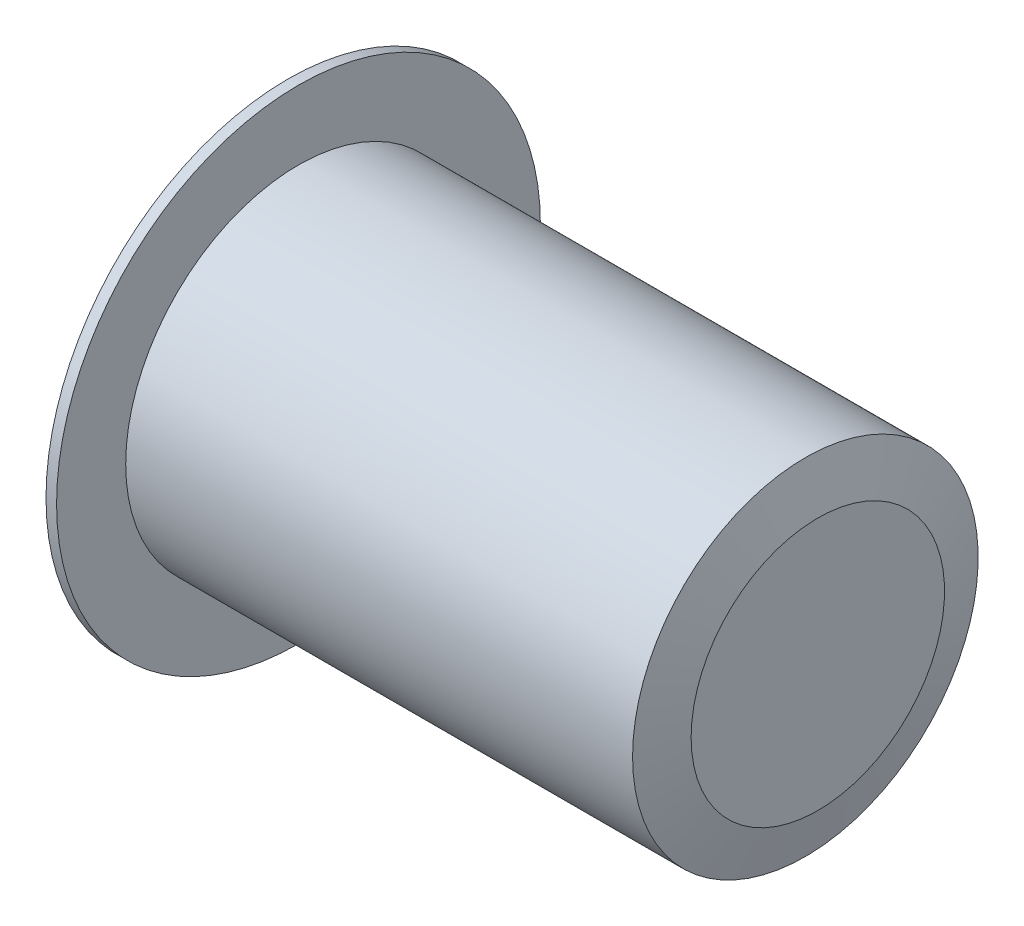
ISO-10303-21;
HEADER;
FILE_DESCRIPTION(('STEP AP214'),'2;1');
FILE_NAME('part.step','',(''),(''),'','','');
FILE_SCHEMA(('AUTOMOTIVE_DESIGN { 1 0 10303 214 1 1 1 1 }'));
ENDSEC;
DATA;
#1=APPLICATION_CONTEXT('core data for automotive mechanical design processes');
#2=APPLICATION_PROTOCOL_DEFINITION('international standard','automotive_design',2000,#1);
#3=PRODUCT_CONTEXT('',#1,'mechanical');
#4=PRODUCT('Part','Part','',(#3));
#5=PRODUCT_RELATED_PRODUCT_CATEGORY('part','',(#4));
#6=PRODUCT_DEFINITION_FORMATION('','',#4);
#7=PRODUCT_DEFINITION_CONTEXT('part definition',#1,'design');
#8=PRODUCT_DEFINITION('design','',#6,#7);
#9=PRODUCT_DEFINITION_SHAPE('','',#8);
#10=(LENGTH_UNIT() NAMED_UNIT(*) SI_UNIT(.MILLI.,.METRE.));
#11=(NAMED_UNIT(*) PLANE_ANGLE_UNIT() SI_UNIT($,.RADIAN.));
#12=(NAMED_UNIT(*) SI_UNIT($,.STERADIAN.) SOLID_ANGLE_UNIT());
#13=UNCERTAINTY_MEASURE_WITH_UNIT(LENGTH_MEASURE(1.E-05),#10,'distance_accuracy_value','');
#14=(GEOMETRIC_REPRESENTATION_CONTEXT(3) GLOBAL_UNCERTAINTY_ASSIGNED_CONTEXT((#13)) GLOBAL_UNIT_ASSIGNED_CONTEXT((#10,
#11,#12)) REPRESENTATION_CONTEXT('',''));
#15=CARTESIAN_POINT('',(0.,0.,0.));
#16=DIRECTION('',(0.,0.,1.));
#17=DIRECTION('',(1.,0.,0.));
#18=AXIS2_PLACEMENT_3D('',#15,#16,#17);
#19=CARTESIAN_POINT('',(230.,0.,0.));
#20=DIRECTION('',(1.,0.,0.));
#21=DIRECTION('',(0.,0.,-1.));
#22=AXIS2_PLACEMENT_3D('',#19,#20,#21);
#23=PLANE('',#22);
#24=CARTESIAN_POINT('',(230.,0.,0.));
#25=DIRECTION('',(-1.,0.,0.));
#26=DIRECTION('',(0.,0.,1.));
#27=AXIS2_PLACEMENT_3D('',#24,#25,#26);
#28=CIRCLE('',#27,55.);
#29=CARTESIAN_POINT('',(230.,0.,55.));
#30=VERTEX_POINT('',#29);
#31=EDGE_CURVE('E10',#30,#30,#28,.T.);
#32=ORIENTED_EDGE('',*,*,#31,.F.);
#33=EDGE_LOOP('',(#32));
#34=FACE_BOUND('',#33,.T.);
#35=ADVANCED_FACE('F37',(#34),#23,.T.);
#36=CARTESIAN_POINT('',(224.590509296755,0.,0.));
#37=DIRECTION('',(-1.,0.,0.));
#38=DIRECTION('',(0.,0.,1.));
#39=AXIS2_PLACEMENT_3D('',#36,#37,#38);
#40=CONICAL_SURFACE('',#39,75.,1.30664225310287);
#41=ORIENTED_EDGE('',*,*,#31,.T.);
#42=EDGE_LOOP('',(#41));
#43=FACE_BOUND('',#42,.T.);
#44=CARTESIAN_POINT('',(224.590509296755,0.,0.));
#45=DIRECTION('',(-1.,0.,0.));
#46=DIRECTION('',(0.,0.,1.));
#47=AXIS2_PLACEMENT_3D('',#44,#45,#46);
#48=CIRCLE('',#47,75.);
#49=CARTESIAN_POINT('',(224.590509296755,0.,75.));
#50=VERTEX_POINT('',#49);
#51=EDGE_CURVE('E43',#50,#50,#48,.T.);
#52=ORIENTED_EDGE('',*,*,#51,.F.);
#53=EDGE_LOOP('',(#52));
#54=FACE_BOUND('',#53,.T.);
#55=ADVANCED_FACE('F92',(#43,#54),#40,.T.);
#56=CARTESIAN_POINT('',(0.,0.,0.));
#57=DIRECTION('',(-1.,0.,0.));
#58=DIRECTION('',(0.,0.,1.));
#59=AXIS2_PLACEMENT_3D('',#56,#57,#58);
#60=CYLINDRICAL_SURFACE('',#59,75.);
#61=ORIENTED_EDGE('',*,*,#51,.T.);
#62=EDGE_LOOP('',(#61));
#63=FACE_BOUND('',#62,.T.);
#64=CARTESIAN_POINT('',(4.59050929675552,0.,0.));
#65=DIRECTION('',(-1.,0.,0.));
#66=DIRECTION('',(0.,0.,1.));
#67=AXIS2_PLACEMENT_3D('',#64,#65,#66);
#68=CIRCLE('',#67,75.);
#69=CARTESIAN_POINT('',(4.59050929675552,0.,75.));
#70=VERTEX_POINT('',#69);
#71=EDGE_CURVE('E47',#70,#70,#68,.T.);
#72=ORIENTED_EDGE('',*,*,#71,.F.);
#73=EDGE_LOOP('',(#72));
#74=FACE_BOUND('',#73,.T.);
#75=ADVANCED_FACE('F88',(#63,#74),#60,.T.);
#76=CARTESIAN_POINT('',(4.59050929675551,0.,0.));
#77=DIRECTION('',(1.,0.,0.));
#78=DIRECTION('',(0.,0.,-1.));
#79=AXIS2_PLACEMENT_3D('',#76,#77,#78);
#80=PLANE('',#79);
#81=ORIENTED_EDGE('',*,*,#71,.T.);
#82=EDGE_LOOP('',(#81));
#83=FACE_BOUND('',#82,.T.);
#84=CARTESIAN_POINT('',(4.5905092967555,0.,0.));
#85=DIRECTION('',(-1.,0.,0.));
#86=DIRECTION('',(0.,0.,1.));
#87=AXIS2_PLACEMENT_3D('',#84,#85,#86);
#88=CIRCLE('',#87,105.);
#89=CARTESIAN_POINT('',(4.5905092967555,0.,105.));
#90=VERTEX_POINT('',#89);
#91=EDGE_CURVE('E51',#90,#90,#88,.T.);
#92=ORIENTED_EDGE('',*,*,#91,.F.);
#93=EDGE_LOOP('',(#92));
#94=FACE_BOUND('',#93,.T.);
#95=ADVANCED_FACE('F82',(#83,#94),#80,.T.);
#96=CARTESIAN_POINT('',(0.,0.,0.));
#97=DIRECTION('',(-1.,0.,0.));
#98=DIRECTION('',(0.,0.,1.));
#99=AXIS2_PLACEMENT_3D('',#96,#97,#98);
#100=CYLINDRICAL_SURFACE('',#99,105.);
#101=ORIENTED_EDGE('',*,*,#91,.T.);
#102=EDGE_LOOP('',(#101));
#103=FACE_BOUND('',#102,.T.);
#104=CARTESIAN_POINT('',(0.,0.,0.));
#105=DIRECTION('',(-1.,0.,0.));
#106=DIRECTION('',(0.,0.,1.));
#107=AXIS2_PLACEMENT_3D('',#104,#105,#106);
#108=CIRCLE('',#107,105.);
#109=CARTESIAN_POINT('',(0.,0.,105.));
#110=VERTEX_POINT('',#109);
#111=EDGE_CURVE('E56',#110,#110,#108,.T.);
#112=ORIENTED_EDGE('',*,*,#111,.F.);
#113=EDGE_LOOP('',(#112));
#114=FACE_BOUND('',#113,.T.);
#115=ADVANCED_FACE('F77',(#103,#114),#100,.T.);
#116=CARTESIAN_POINT('',(0.,0.,0.));
#117=DIRECTION('',(1.,0.,0.));
#118=DIRECTION('',(0.,0.,-1.));
#119=AXIS2_PLACEMENT_3D('',#116,#117,#118);
#120=PLANE('',#119);
#121=CARTESIAN_POINT('',(0.,0.,0.));
#122=DIRECTION('',(-1.,0.,0.));
#123=DIRECTION('',(0.,0.,1.));
#124=AXIS2_PLACEMENT_3D('',#121,#122,#123);
#125=CIRCLE('',#124,30.);
#126=CARTESIAN_POINT('',(0.,0.,30.));
#127=VERTEX_POINT('',#126);
#128=EDGE_CURVE('E59',#127,#127,#125,.T.);
#129=ORIENTED_EDGE('',*,*,#128,.F.);
#130=EDGE_LOOP('',(#129));
#131=FACE_BOUND('',#130,.T.);
#132=ORIENTED_EDGE('',*,*,#111,.T.);
#133=EDGE_LOOP('',(#132));
#134=FACE_BOUND('',#133,.T.);
#135=ADVANCED_FACE('F71',(#131,#134),#120,.F.);
#136=CARTESIAN_POINT('',(0.,0.,0.));
#137=DIRECTION('',(-1.,0.,0.));
#138=DIRECTION('',(0.,0.,1.));
#139=AXIS2_PLACEMENT_3D('',#136,#137,#138);
#140=CYLINDRICAL_SURFACE('',#139,30.);
#141=CARTESIAN_POINT('',(180.,0.,0.));
#142=DIRECTION('',(-1.,0.,0.));
#143=DIRECTION('',(0.,0.,1.));
#144=AXIS2_PLACEMENT_3D('',#141,#142,#143);
#145=CIRCLE('',#144,30.);
#146=CARTESIAN_POINT('',(180.,0.,30.));
#147=VERTEX_POINT('',#146);
#148=EDGE_CURVE('E62',#147,#147,#145,.T.);
#149=ORIENTED_EDGE('',*,*,#148,.F.);
#150=EDGE_LOOP('',(#149));
#151=FACE_BOUND('',#150,.T.);
#152=ORIENTED_EDGE('',*,*,#128,.T.);
#153=EDGE_LOOP('',(#152));
#154=FACE_BOUND('',#153,.T.);
#155=ADVANCED_FACE('F68',(#151,#154),#140,.F.);
#156=CARTESIAN_POINT('',(180.,0.,0.));
#157=DIRECTION('',(1.,0.,0.));
#158=DIRECTION('',(0.,0.,-1.));
#159=AXIS2_PLACEMENT_3D('',#156,#157,#158);
#160=PLANE('',#159);
#161=ORIENTED_EDGE('',*,*,#148,.T.);
#162=EDGE_LOOP('',(#161));
#163=FACE_BOUND('',#162,.T.);
#164=ADVANCED_FACE('F66',(#163),#160,.F.);
#165=CLOSED_SHELL('',(#35,#55,#75,#95,#115,#135,#155,#164));
#166=MANIFOLD_SOLID_BREP('B2',#165);
#167=ADVANCED_BREP_SHAPE_REPRESENTATION('',(#18,#166),#14);
#168=SHAPE_DEFINITION_REPRESENTATION(#9,#167);
ENDSEC;
END-ISO-10303-21;
